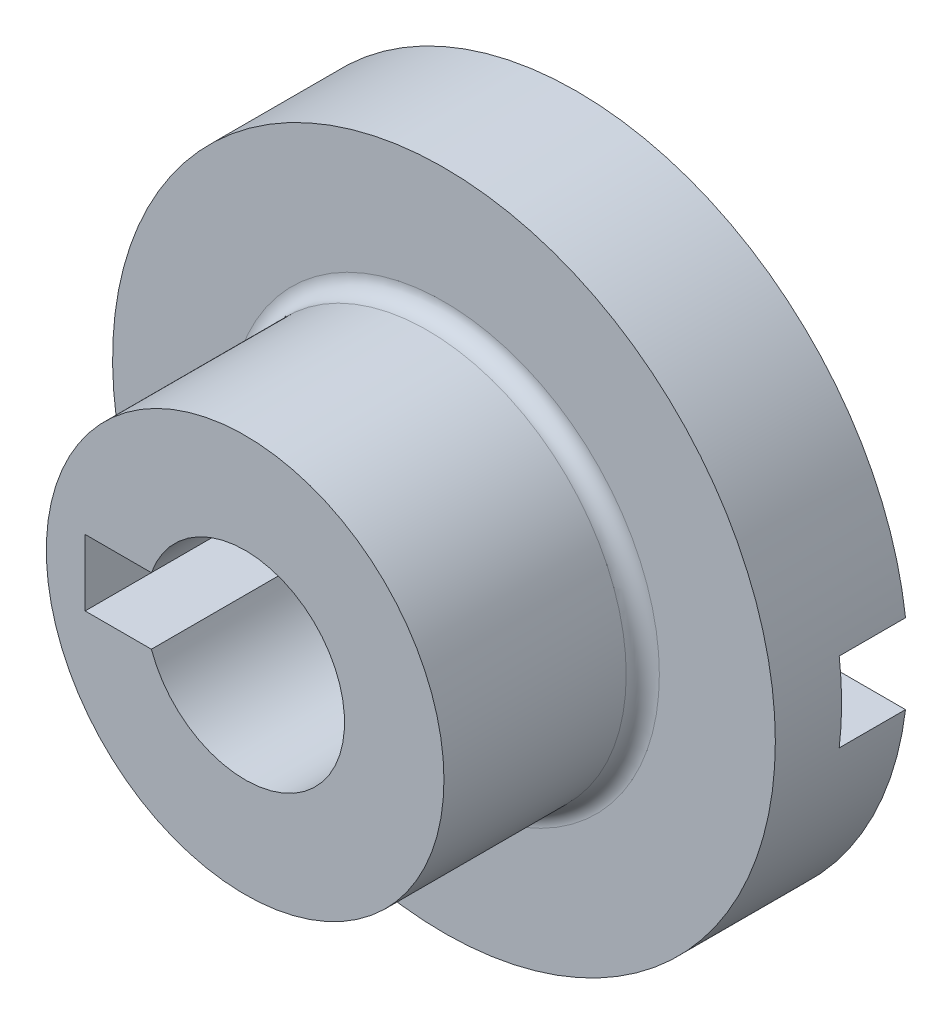
ISO-10303-21;
HEADER;
FILE_DESCRIPTION(('STEP AP214'),'2;1');
FILE_NAME('part.step','',(''),(''),'','','');
FILE_SCHEMA(('AUTOMOTIVE_DESIGN { 1 0 10303 214 1 1 1 1 }'));
ENDSEC;
DATA;
#1=APPLICATION_CONTEXT('core data for automotive mechanical design processes');
#2=APPLICATION_PROTOCOL_DEFINITION('international standard','automotive_design',2000,#1);
#3=PRODUCT_CONTEXT('',#1,'mechanical');
#4=PRODUCT('Part','Part','',(#3));
#5=PRODUCT_RELATED_PRODUCT_CATEGORY('part','',(#4));
#6=PRODUCT_DEFINITION_FORMATION('','',#4);
#7=PRODUCT_DEFINITION_CONTEXT('part definition',#1,'design');
#8=PRODUCT_DEFINITION('design','',#6,#7);
#9=PRODUCT_DEFINITION_SHAPE('','',#8);
#10=(LENGTH_UNIT() NAMED_UNIT(*) SI_UNIT(.MILLI.,.METRE.));
#11=(NAMED_UNIT(*) PLANE_ANGLE_UNIT() SI_UNIT($,.RADIAN.));
#12=(NAMED_UNIT(*) SI_UNIT($,.STERADIAN.) SOLID_ANGLE_UNIT());
#13=UNCERTAINTY_MEASURE_WITH_UNIT(LENGTH_MEASURE(1.E-05),#10,'distance_accuracy_value','');
#14=(GEOMETRIC_REPRESENTATION_CONTEXT(3) GLOBAL_UNCERTAINTY_ASSIGNED_CONTEXT((#13)) GLOBAL_UNIT_ASSIGNED_CONTEXT((#10,
#11,#12)) REPRESENTATION_CONTEXT('',''));
#15=CARTESIAN_POINT('',(0.,0.,0.));
#16=DIRECTION('',(0.,0.,1.));
#17=DIRECTION('',(1.,0.,0.));
#18=AXIS2_PLACEMENT_3D('',#15,#16,#17);
#19=CARTESIAN_POINT('',(0.,0.,10.));
#20=DIRECTION('',(0.,0.,-1.));
#21=DIRECTION('',(-1.,0.,0.));
#22=AXIS2_PLACEMENT_3D('',#19,#20,#21);
#23=PLANE('',#22);
#24=CARTESIAN_POINT('',(0.,0.,10.));
#25=DIRECTION('',(0.,0.,-1.));
#26=DIRECTION('',(-1.,0.,0.));
#27=AXIS2_PLACEMENT_3D('',#24,#25,#26);
#28=CIRCLE('',#27,15.);
#29=CARTESIAN_POINT('',(13.7477270848675,6.,10.));
#30=VERTEX_POINT('',#29);
#31=CARTESIAN_POINT('',(13.7477270848675,-6.,9.99999999999999));
#32=VERTEX_POINT('',#31);
#33=EDGE_CURVE('E153',#30,#32,#28,.T.);
#34=ORIENTED_EDGE('',*,*,#33,.F.);
#35=DIRECTION('',(1.,0.,0.));
#36=VECTOR('',#35,1.);
#37=CARTESIAN_POINT('',(55.,6.,10.));
#38=LINE('',#37,#36);
#39=CARTESIAN_POINT('',(49.6386945839634,6.,10.));
#40=VERTEX_POINT('',#39);
#41=EDGE_CURVE('E165',#30,#40,#38,.T.);
#42=ORIENTED_EDGE('',*,*,#41,.T.);
#43=CARTESIAN_POINT('',(0.,0.,10.));
#44=DIRECTION('',(0.,0.,-1.));
#45=DIRECTION('',(-1.,0.,0.));
#46=AXIS2_PLACEMENT_3D('',#43,#44,#45);
#47=CIRCLE('',#46,50.);
#48=CARTESIAN_POINT('',(49.6386945839634,-6.,10.));
#49=VERTEX_POINT('',#48);
#50=EDGE_CURVE('E208',#40,#49,#47,.T.);
#51=ORIENTED_EDGE('',*,*,#50,.T.);
#52=DIRECTION('',(-1.,0.,0.));
#53=VECTOR('',#52,1.);
#54=CARTESIAN_POINT('',(55.,-6.,10.));
#55=LINE('',#54,#53);
#56=EDGE_CURVE('E162',#49,#32,#55,.T.);
#57=ORIENTED_EDGE('',*,*,#56,.T.);
#58=EDGE_LOOP('',(#34,#42,#51,#57));
#59=FACE_BOUND('',#58,.T.);
#60=ADVANCED_FACE('F33',(#59),#23,.T.);
#61=CARTESIAN_POINT('',(55.,6.,10.));
#62=DIRECTION('',(0.,1.,0.));
#63=DIRECTION('',(0.,0.,1.));
#64=AXIS2_PLACEMENT_3D('',#61,#62,#63);
#65=PLANE('',#64);
#66=DIRECTION('',(-1.,0.,0.));
#67=VECTOR('',#66,1.);
#68=CARTESIAN_POINT('',(0.,6.,0.));
#69=LINE('',#68,#67);
#70=CARTESIAN_POINT('',(-13.7477270848675,6.,0.));
#71=VERTEX_POINT('',#70);
#72=CARTESIAN_POINT('',(-49.6386945839634,6.,0.));
#73=VERTEX_POINT('',#72);
#74=EDGE_CURVE('E202',#71,#73,#69,.T.);
#75=ORIENTED_EDGE('',*,*,#74,.F.);
#76=DIRECTION('',(0.,0.,1.));
#77=VECTOR('',#76,1.);
#78=CARTESIAN_POINT('',(-13.7477270848675,6.,-49.3163946491078));
#79=LINE('',#78,#77);
#80=CARTESIAN_POINT('',(-13.7477270848675,6.,9.99999999999999));
#81=VERTEX_POINT('',#80);
#82=EDGE_CURVE('E159',#71,#81,#79,.T.);
#83=ORIENTED_EDGE('',*,*,#82,.T.);
#84=CARTESIAN_POINT('',(-49.6386945839634,6.,10.));
#85=VERTEX_POINT('',#84);
#86=EDGE_CURVE('E167',#85,#81,#38,.T.);
#87=ORIENTED_EDGE('',*,*,#86,.F.);
#88=DIRECTION('',(0.,0.,-1.));
#89=VECTOR('',#88,1.);
#90=CARTESIAN_POINT('',(-49.6386945839634,6.,20.));
#91=LINE('',#90,#89);
#92=EDGE_CURVE('E176',#73,#85,#91,.F.);
#93=ORIENTED_EDGE('',*,*,#92,.F.);
#94=EDGE_LOOP('',(#75,#83,#87,#93));
#95=FACE_BOUND('',#94,.T.);
#96=ADVANCED_FACE('F249',(#95),#65,.F.);
#97=CARTESIAN_POINT('',(55.,-6.,10.));
#98=DIRECTION('',(0.,-1.,0.));
#99=DIRECTION('',(0.,0.,-1.));
#100=AXIS2_PLACEMENT_3D('',#97,#98,#99);
#101=PLANE('',#100);
#102=DIRECTION('',(1.,0.,0.));
#103=VECTOR('',#102,1.);
#104=CARTESIAN_POINT('',(0.,-6.,0.));
#105=LINE('',#104,#103);
#106=CARTESIAN_POINT('',(13.7477270848675,-6.,0.));
#107=VERTEX_POINT('',#106);
#108=CARTESIAN_POINT('',(49.6386945839634,-6.,0.));
#109=VERTEX_POINT('',#108);
#110=EDGE_CURVE('E198',#107,#109,#105,.T.);
#111=ORIENTED_EDGE('',*,*,#110,.F.);
#112=DIRECTION('',(0.,0.,1.));
#113=VECTOR('',#112,1.);
#114=CARTESIAN_POINT('',(13.7477270848675,-6.,-49.3163946491078));
#115=LINE('',#114,#113);
#116=EDGE_CURVE('E211',#107,#32,#115,.T.);
#117=ORIENTED_EDGE('',*,*,#116,.T.);
#118=ORIENTED_EDGE('',*,*,#56,.F.);
#119=DIRECTION('',(0.,0.,-1.));
#120=VECTOR('',#119,1.);
#121=CARTESIAN_POINT('',(49.6386945839634,-6.,20.));
#122=LINE('',#121,#120);
#123=EDGE_CURVE('E170',#109,#49,#122,.F.);
#124=ORIENTED_EDGE('',*,*,#123,.F.);
#125=EDGE_LOOP('',(#111,#117,#118,#124));
#126=FACE_BOUND('',#125,.T.);
#127=ADVANCED_FACE('F226',(#126),#101,.F.);
#128=CARTESIAN_POINT('',(0.,0.,0.));
#129=DIRECTION('',(0.,0.,1.));
#130=DIRECTION('',(1.,0.,0.));
#131=AXIS2_PLACEMENT_3D('',#128,#129,#130);
#132=PLANE('',#131);
#133=CARTESIAN_POINT('',(49.6386945839634,6.,0.));
#134=VERTEX_POINT('',#133);
#135=CARTESIAN_POINT('',(13.7477270848675,6.,0.));
#136=VERTEX_POINT('',#135);
#137=EDGE_CURVE('E203',#134,#136,#69,.T.);
#138=ORIENTED_EDGE('',*,*,#137,.T.);
#139=CARTESIAN_POINT('',(0.,0.,0.));
#140=DIRECTION('',(0.,0.,1.));
#141=DIRECTION('',(1.,0.,0.));
#142=AXIS2_PLACEMENT_3D('',#139,#140,#141);
#143=CIRCLE('',#142,15.);
#144=EDGE_CURVE('E154',#71,#136,#143,.F.);
#145=ORIENTED_EDGE('',*,*,#144,.F.);
#146=ORIENTED_EDGE('',*,*,#74,.T.);
#147=CARTESIAN_POINT('',(0.,0.,0.));
#148=DIRECTION('',(0.,0.,1.));
#149=DIRECTION('',(1.,0.,0.));
#150=AXIS2_PLACEMENT_3D('',#147,#148,#149);
#151=CIRCLE('',#150,50.);
#152=EDGE_CURVE('E190',#134,#73,#151,.T.);
#153=ORIENTED_EDGE('',*,*,#152,.F.);
#154=EDGE_LOOP('',(#138,#145,#146,#153));
#155=FACE_BOUND('',#154,.T.);
#156=ADVANCED_FACE('F246',(#155),#132,.F.);
#157=CARTESIAN_POINT('',(0.,0.,20.));
#158=DIRECTION('',(0.,0.,-1.));
#159=DIRECTION('',(-1.,0.,0.));
#160=AXIS2_PLACEMENT_3D('',#157,#158,#159);
#161=CYLINDRICAL_SURFACE('',#160,50.);
#162=ORIENTED_EDGE('',*,*,#50,.F.);
#163=DIRECTION('',(0.,0.,-1.));
#164=VECTOR('',#163,1.);
#165=CARTESIAN_POINT('',(49.6386945839634,6.,20.));
#166=LINE('',#165,#164);
#167=EDGE_CURVE('E179',#40,#134,#166,.T.);
#168=ORIENTED_EDGE('',*,*,#167,.T.);
#169=ORIENTED_EDGE('',*,*,#152,.T.);
#170=ORIENTED_EDGE('',*,*,#92,.T.);
#171=CARTESIAN_POINT('',(-49.6386945839634,-6.,10.));
#172=VERTEX_POINT('',#171);
#173=EDGE_CURVE('E206',#172,#85,#47,.T.);
#174=ORIENTED_EDGE('',*,*,#173,.F.);
#175=DIRECTION('',(0.,0.,-1.));
#176=VECTOR('',#175,1.);
#177=CARTESIAN_POINT('',(-49.6386945839634,-6.,20.));
#178=LINE('',#177,#176);
#179=CARTESIAN_POINT('',(-49.6386945839634,-6.,0.));
#180=VERTEX_POINT('',#179);
#181=EDGE_CURVE('E173',#172,#180,#178,.T.);
#182=ORIENTED_EDGE('',*,*,#181,.T.);
#183=EDGE_CURVE('E185',#180,#109,#151,.T.);
#184=ORIENTED_EDGE('',*,*,#183,.T.);
#185=ORIENTED_EDGE('',*,*,#123,.T.);
#186=EDGE_LOOP('',(#162,#168,#169,#170,#174,#182,#184,#185));
#187=FACE_BOUND('',#186,.T.);
#188=CARTESIAN_POINT('',(0.,0.,20.));
#189=DIRECTION('',(0.,0.,1.));
#190=DIRECTION('',(1.,0.,0.));
#191=AXIS2_PLACEMENT_3D('',#188,#189,#190);
#192=CIRCLE('',#191,50.);
#193=CARTESIAN_POINT('',(50.,0.,20.));
#194=VERTEX_POINT('',#193);
#195=EDGE_CURVE('E186',#194,#194,#192,.T.);
#196=ORIENTED_EDGE('',*,*,#195,.F.);
#197=EDGE_LOOP('',(#196));
#198=FACE_BOUND('',#197,.T.);
#199=ADVANCED_FACE('F231',(#187,#198),#161,.T.);
#200=CARTESIAN_POINT('',(0.,0.,20.));
#201=DIRECTION('',(0.,0.,1.));
#202=DIRECTION('',(1.,0.,0.));
#203=AXIS2_PLACEMENT_3D('',#200,#201,#202);
#204=PLANE('',#203);
#205=CARTESIAN_POINT('',(0.,0.,20.));
#206=DIRECTION('',(0.,0.,1.));
#207=DIRECTION('',(1.,0.,0.));
#208=AXIS2_PLACEMENT_3D('',#205,#206,#207);
#209=CIRCLE('',#208,32.5);
#210=CARTESIAN_POINT('',(32.5,0.,20.));
#211=VERTEX_POINT('',#210);
#212=EDGE_CURVE('E195',#211,#211,#209,.F.);
#213=ORIENTED_EDGE('',*,*,#212,.T.);
#214=EDGE_LOOP('',(#213));
#215=FACE_BOUND('',#214,.T.);
#216=ORIENTED_EDGE('',*,*,#195,.T.);
#217=EDGE_LOOP('',(#216));
#218=FACE_BOUND('',#217,.T.);
#219=ADVANCED_FACE('F370',(#215,#218),#204,.T.);
#220=CARTESIAN_POINT('',(-13.7477270848675,-6.,0.));
#221=VERTEX_POINT('',#220);
#222=EDGE_CURVE('E199',#180,#221,#105,.T.);
#223=ORIENTED_EDGE('',*,*,#222,.T.);
#224=EDGE_CURVE('E55',#107,#221,#143,.F.);
#225=ORIENTED_EDGE('',*,*,#224,.F.);
#226=ORIENTED_EDGE('',*,*,#110,.T.);
#227=ORIENTED_EDGE('',*,*,#183,.F.);
#228=EDGE_LOOP('',(#223,#225,#226,#227));
#229=FACE_BOUND('',#228,.T.);
#230=ADVANCED_FACE('F239',(#229),#132,.F.);
#231=CARTESIAN_POINT('',(0.,0.,50.));
#232=DIRECTION('',(0.,0.,-1.));
#233=DIRECTION('',(-1.,0.,0.));
#234=AXIS2_PLACEMENT_3D('',#231,#232,#233);
#235=CYLINDRICAL_SURFACE('',#234,30.);
#236=CARTESIAN_POINT('',(0.,0.,22.5));
#237=DIRECTION('',(0.,0.,1.));
#238=DIRECTION('',(1.,0.,0.));
#239=AXIS2_PLACEMENT_3D('',#236,#237,#238);
#240=CIRCLE('',#239,30.);
#241=CARTESIAN_POINT('',(30.,0.,22.5));
#242=VERTEX_POINT('',#241);
#243=EDGE_CURVE('E189',#242,#242,#240,.T.);
#244=ORIENTED_EDGE('',*,*,#243,.T.);
#245=EDGE_LOOP('',(#244));
#246=FACE_BOUND('',#245,.T.);
#247=CARTESIAN_POINT('',(0.,0.,50.));
#248=DIRECTION('',(0.,0.,1.));
#249=DIRECTION('',(1.,0.,0.));
#250=AXIS2_PLACEMENT_3D('',#247,#248,#249);
#251=CIRCLE('',#250,30.);
#252=CARTESIAN_POINT('',(30.,0.,50.));
#253=VERTEX_POINT('',#252);
#254=EDGE_CURVE('E182',#253,#253,#251,.T.);
#255=ORIENTED_EDGE('',*,*,#254,.F.);
#256=EDGE_LOOP('',(#255));
#257=FACE_BOUND('',#256,.T.);
#258=ADVANCED_FACE('F355',(#246,#257),#235,.T.);
#259=CARTESIAN_POINT('',(0.,0.,50.));
#260=DIRECTION('',(0.,0.,1.));
#261=DIRECTION('',(1.,0.,0.));
#262=AXIS2_PLACEMENT_3D('',#259,#260,#261);
#263=PLANE('',#262);
#264=CARTESIAN_POINT('',(0.,0.,50.));
#265=DIRECTION('',(0.,0.,1.));
#266=DIRECTION('',(1.,0.,0.));
#267=AXIS2_PLACEMENT_3D('',#264,#265,#266);
#268=CIRCLE('',#267,15.);
#269=CARTESIAN_POINT('',(-14.142135623731,-5.,50.));
#270=VERTEX_POINT('',#269);
#271=CARTESIAN_POINT('',(-14.142135623731,5.,50.));
#272=VERTEX_POINT('',#271);
#273=EDGE_CURVE('E48',#270,#272,#268,.T.);
#274=ORIENTED_EDGE('',*,*,#273,.F.);
#275=DIRECTION('',(1.,0.,0.));
#276=VECTOR('',#275,1.);
#277=CARTESIAN_POINT('',(-24.142135623731,-5.,50.));
#278=LINE('',#277,#276);
#279=CARTESIAN_POINT('',(-24.142135623731,-5.,50.));
#280=VERTEX_POINT('',#279);
#281=EDGE_CURVE('E142',#280,#270,#278,.T.);
#282=ORIENTED_EDGE('',*,*,#281,.F.);
#283=DIRECTION('',(0.,-1.,0.));
#284=VECTOR('',#283,1.);
#285=CARTESIAN_POINT('',(-24.142135623731,5.,50.));
#286=LINE('',#285,#284);
#287=CARTESIAN_POINT('',(-24.142135623731,5.,50.));
#288=VERTEX_POINT('',#287);
#289=EDGE_CURVE('E126',#288,#280,#286,.T.);
#290=ORIENTED_EDGE('',*,*,#289,.F.);
#291=DIRECTION('',(-1.,0.,0.));
#292=VECTOR('',#291,1.);
#293=CARTESIAN_POINT('',(-14.142135623731,5.,50.));
#294=LINE('',#293,#292);
#295=EDGE_CURVE('E135',#272,#288,#294,.T.);
#296=ORIENTED_EDGE('',*,*,#295,.F.);
#297=EDGE_LOOP('',(#274,#282,#290,#296));
#298=FACE_BOUND('',#297,.T.);
#299=ORIENTED_EDGE('',*,*,#254,.T.);
#300=EDGE_LOOP('',(#299));
#301=FACE_BOUND('',#300,.T.);
#302=ADVANCED_FACE('F139',(#298,#301),#263,.T.);
#303=CARTESIAN_POINT('',(0.,0.,22.5));
#304=DIRECTION('',(0.,0.,1.));
#305=DIRECTION('',(1.,0.,0.));
#306=AXIS2_PLACEMENT_3D('',#303,#304,#305);
#307=TOROIDAL_SURFACE('',#306,32.5,2.5);
#308=ORIENTED_EDGE('',*,*,#212,.F.);
#309=EDGE_LOOP('',(#308));
#310=FACE_BOUND('',#309,.T.);
#311=ORIENTED_EDGE('',*,*,#243,.F.);
#312=EDGE_LOOP('',(#311));
#313=FACE_BOUND('',#312,.T.);
#314=ADVANCED_FACE('F35',(#310,#313),#307,.F.);
#315=CARTESIAN_POINT('',(-14.142135623731,5.,10.));
#316=VERTEX_POINT('',#315);
#317=EDGE_CURVE('E155',#316,#81,#28,.T.);
#318=ORIENTED_EDGE('',*,*,#317,.F.);
#319=DIRECTION('',(1.,0.,0.));
#320=VECTOR('',#319,1.);
#321=CARTESIAN_POINT('',(0.,5.,10.));
#322=LINE('',#321,#320);
#323=CARTESIAN_POINT('',(-24.142135623731,5.,10.));
#324=VERTEX_POINT('',#323);
#325=EDGE_CURVE('E214',#324,#316,#322,.T.);
#326=ORIENTED_EDGE('',*,*,#325,.F.);
#327=DIRECTION('',(0.,1.,0.));
#328=VECTOR('',#327,1.);
#329=CARTESIAN_POINT('',(-24.142135623731,0.,10.));
#330=LINE('',#329,#328);
#331=CARTESIAN_POINT('',(-24.142135623731,-5.,10.));
#332=VERTEX_POINT('',#331);
#333=EDGE_CURVE('E41',#332,#324,#330,.T.);
#334=ORIENTED_EDGE('',*,*,#333,.F.);
#335=DIRECTION('',(-1.,0.,0.));
#336=VECTOR('',#335,1.);
#337=CARTESIAN_POINT('',(0.,-5.,10.));
#338=LINE('',#337,#336);
#339=CARTESIAN_POINT('',(-14.142135623731,-5.,10.));
#340=VERTEX_POINT('',#339);
#341=EDGE_CURVE('E11',#340,#332,#338,.T.);
#342=ORIENTED_EDGE('',*,*,#341,.F.);
#343=CARTESIAN_POINT('',(-13.7477270848675,-6.,9.99999999999999));
#344=VERTEX_POINT('',#343);
#345=EDGE_CURVE('E151',#344,#340,#28,.T.);
#346=ORIENTED_EDGE('',*,*,#345,.F.);
#347=EDGE_CURVE('E166',#344,#172,#55,.T.);
#348=ORIENTED_EDGE('',*,*,#347,.T.);
#349=ORIENTED_EDGE('',*,*,#173,.T.);
#350=ORIENTED_EDGE('',*,*,#86,.T.);
#351=EDGE_LOOP('',(#318,#326,#334,#342,#346,#348,#349,#350));
#352=FACE_BOUND('',#351,.T.);
#353=ADVANCED_FACE('F218',(#352),#23,.T.);
#354=ORIENTED_EDGE('',*,*,#41,.F.);
#355=DIRECTION('',(0.,0.,1.));
#356=VECTOR('',#355,1.);
#357=CARTESIAN_POINT('',(13.7477270848675,6.,-49.3163946491078));
#358=LINE('',#357,#356);
#359=EDGE_CURVE('E156',#30,#136,#358,.F.);
#360=ORIENTED_EDGE('',*,*,#359,.T.);
#361=ORIENTED_EDGE('',*,*,#137,.F.);
#362=ORIENTED_EDGE('',*,*,#167,.F.);
#363=EDGE_LOOP('',(#354,#360,#361,#362));
#364=FACE_BOUND('',#363,.T.);
#365=ADVANCED_FACE('F245',(#364),#65,.F.);
#366=ORIENTED_EDGE('',*,*,#347,.F.);
#367=DIRECTION('',(0.,0.,1.));
#368=VECTOR('',#367,1.);
#369=CARTESIAN_POINT('',(-13.7477270848675,-6.,-49.3163946491078));
#370=LINE('',#369,#368);
#371=EDGE_CURVE('E209',#344,#221,#370,.F.);
#372=ORIENTED_EDGE('',*,*,#371,.T.);
#373=ORIENTED_EDGE('',*,*,#222,.F.);
#374=ORIENTED_EDGE('',*,*,#181,.F.);
#375=EDGE_LOOP('',(#366,#372,#373,#374));
#376=FACE_BOUND('',#375,.T.);
#377=ADVANCED_FACE('F257',(#376),#101,.F.);
#378=CARTESIAN_POINT('',(0.,0.,-49.3163946491078));
#379=DIRECTION('',(0.,0.,1.));
#380=DIRECTION('',(1.,0.,0.));
#381=AXIS2_PLACEMENT_3D('',#378,#379,#380);
#382=CYLINDRICAL_SURFACE('',#381,15.);
#383=ORIENTED_EDGE('',*,*,#317,.T.);
#384=ORIENTED_EDGE('',*,*,#82,.F.);
#385=ORIENTED_EDGE('',*,*,#144,.T.);
#386=ORIENTED_EDGE('',*,*,#359,.F.);
#387=ORIENTED_EDGE('',*,*,#33,.T.);
#388=ORIENTED_EDGE('',*,*,#116,.F.);
#389=ORIENTED_EDGE('',*,*,#224,.T.);
#390=ORIENTED_EDGE('',*,*,#371,.F.);
#391=ORIENTED_EDGE('',*,*,#345,.T.);
#392=DIRECTION('',(0.,0.,1.));
#393=VECTOR('',#392,1.);
#394=CARTESIAN_POINT('',(-14.142135623731,-5.,-49.3163946491078));
#395=LINE('',#394,#393);
#396=EDGE_CURVE('E147',#340,#270,#395,.T.);
#397=ORIENTED_EDGE('',*,*,#396,.T.);
#398=ORIENTED_EDGE('',*,*,#273,.T.);
#399=DIRECTION('',(0.,0.,1.));
#400=VECTOR('',#399,1.);
#401=CARTESIAN_POINT('',(-14.142135623731,5.,-49.3163946491078));
#402=LINE('',#401,#400);
#403=EDGE_CURVE('E132',#316,#272,#402,.T.);
#404=ORIENTED_EDGE('',*,*,#403,.F.);
#405=EDGE_LOOP('',(#383,#384,#385,#386,#387,#388,#389,#390,#391,#397,#398,#404));
#406=FACE_BOUND('',#405,.T.);
#407=ADVANCED_FACE('F217',(#406),#382,.F.);
#408=CARTESIAN_POINT('',(-24.142135623731,-5.,-49.3163946491078));
#409=DIRECTION('',(0.,-1.,0.));
#410=DIRECTION('',(1.,0.,0.));
#411=AXIS2_PLACEMENT_3D('',#408,#409,#410);
#412=PLANE('',#411);
#413=ORIENTED_EDGE('',*,*,#341,.T.);
#414=DIRECTION('',(0.,0.,1.));
#415=VECTOR('',#414,1.);
#416=CARTESIAN_POINT('',(-24.142135623731,-5.,-49.3163946491078));
#417=LINE('',#416,#415);
#418=EDGE_CURVE('E131',#332,#280,#417,.T.);
#419=ORIENTED_EDGE('',*,*,#418,.T.);
#420=ORIENTED_EDGE('',*,*,#281,.T.);
#421=ORIENTED_EDGE('',*,*,#396,.F.);
#422=EDGE_LOOP('',(#413,#419,#420,#421));
#423=FACE_BOUND('',#422,.T.);
#424=ADVANCED_FACE('F272',(#423),#412,.F.);
#425=CARTESIAN_POINT('',(-24.142135623731,5.,-49.3163946491078));
#426=DIRECTION('',(-1.,0.,0.));
#427=DIRECTION('',(0.,0.,1.));
#428=AXIS2_PLACEMENT_3D('',#425,#426,#427);
#429=PLANE('',#428);
#430=ORIENTED_EDGE('',*,*,#333,.T.);
#431=DIRECTION('',(0.,0.,1.));
#432=VECTOR('',#431,1.);
#433=CARTESIAN_POINT('',(-24.142135623731,5.,-49.3163946491078));
#434=LINE('',#433,#432);
#435=EDGE_CURVE('E121',#324,#288,#434,.T.);
#436=ORIENTED_EDGE('',*,*,#435,.T.);
#437=ORIENTED_EDGE('',*,*,#289,.T.);
#438=ORIENTED_EDGE('',*,*,#418,.F.);
#439=EDGE_LOOP('',(#430,#436,#437,#438));
#440=FACE_BOUND('',#439,.T.);
#441=ADVANCED_FACE('F123',(#440),#429,.F.);
#442=CARTESIAN_POINT('',(-14.142135623731,5.,-49.3163946491078));
#443=DIRECTION('',(0.,1.,0.));
#444=DIRECTION('',(0.,0.,1.));
#445=AXIS2_PLACEMENT_3D('',#442,#443,#444);
#446=PLANE('',#445);
#447=ORIENTED_EDGE('',*,*,#325,.T.);
#448=ORIENTED_EDGE('',*,*,#403,.T.);
#449=ORIENTED_EDGE('',*,*,#295,.T.);
#450=ORIENTED_EDGE('',*,*,#435,.F.);
#451=EDGE_LOOP('',(#447,#448,#449,#450));
#452=FACE_BOUND('',#451,.T.);
#453=ADVANCED_FACE('F136',(#452),#446,.F.);
#454=CLOSED_SHELL('',(#60,#96,#127,#156,#199,#219,#230,#258,#302,#314,#353,#365,#377,#407,#424,
#441,#453));
#455=MANIFOLD_SOLID_BREP('B2',#454);
#456=ADVANCED_BREP_SHAPE_REPRESENTATION('',(#18,#455),#14);
#457=SHAPE_DEFINITION_REPRESENTATION(#9,#456);
ENDSEC;
END-ISO-10303-21;
